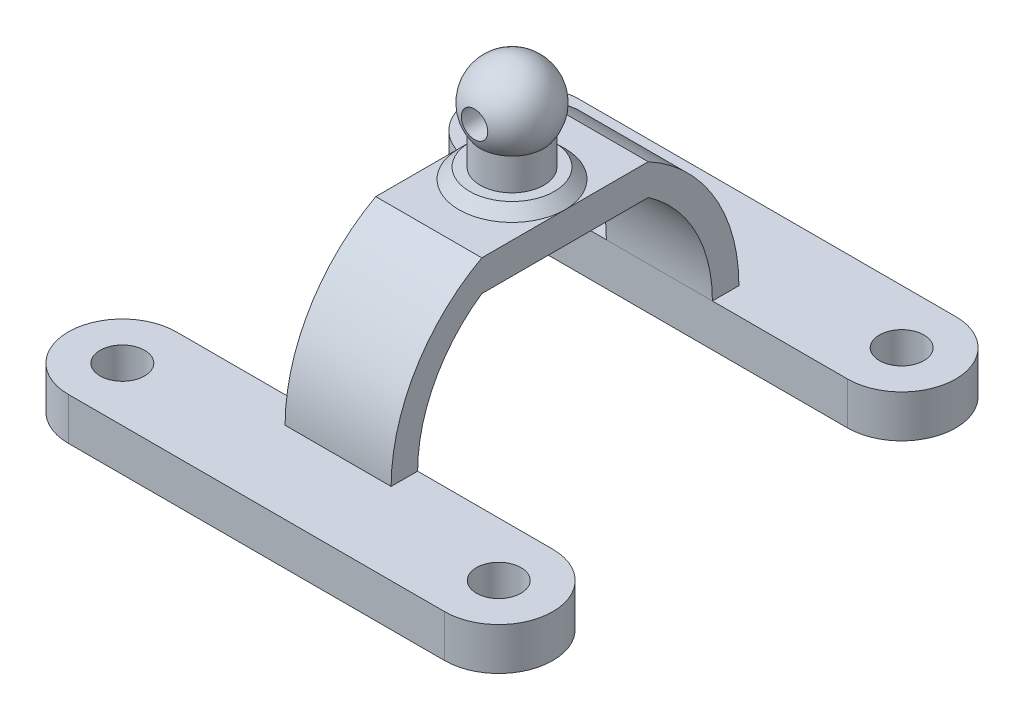
ISO-10303-21;
HEADER;
FILE_DESCRIPTION(('STEP AP214'),'2;1');
FILE_NAME('part.step','',(''),(''),'','','');
FILE_SCHEMA(('AUTOMOTIVE_DESIGN { 1 0 10303 214 1 1 1 1 }'));
ENDSEC;
DATA;
#1=APPLICATION_CONTEXT('core data for automotive mechanical design processes');
#2=APPLICATION_PROTOCOL_DEFINITION('international standard','automotive_design',2000,#1);
#3=PRODUCT_CONTEXT('',#1,'mechanical');
#4=PRODUCT('Part','Part','',(#3));
#5=PRODUCT_RELATED_PRODUCT_CATEGORY('part','',(#4));
#6=PRODUCT_DEFINITION_FORMATION('','',#4);
#7=PRODUCT_DEFINITION_CONTEXT('part definition',#1,'design');
#8=PRODUCT_DEFINITION('design','',#6,#7);
#9=PRODUCT_DEFINITION_SHAPE('','',#8);
#10=(LENGTH_UNIT() NAMED_UNIT(*) SI_UNIT(.MILLI.,.METRE.));
#11=(NAMED_UNIT(*) PLANE_ANGLE_UNIT() SI_UNIT($,.RADIAN.));
#12=(NAMED_UNIT(*) SI_UNIT($,.STERADIAN.) SOLID_ANGLE_UNIT());
#13=UNCERTAINTY_MEASURE_WITH_UNIT(LENGTH_MEASURE(1.E-05),#10,'distance_accuracy_value','');
#14=(GEOMETRIC_REPRESENTATION_CONTEXT(3) GLOBAL_UNCERTAINTY_ASSIGNED_CONTEXT((#13)) GLOBAL_UNIT_ASSIGNED_CONTEXT((#10,
#11,#12)) REPRESENTATION_CONTEXT('',''));
#15=CARTESIAN_POINT('',(0.,0.,0.));
#16=DIRECTION('',(0.,0.,1.));
#17=DIRECTION('',(1.,0.,0.));
#18=AXIS2_PLACEMENT_3D('',#15,#16,#17);
#19=CARTESIAN_POINT('',(5.,36.395,0.));
#20=DIRECTION('',(0.,1.,0.));
#21=DIRECTION('',(0.,0.,1.));
#22=AXIS2_PLACEMENT_3D('',#19,#20,#21);
#23=PLANE('',#22);
#24=CARTESIAN_POINT('',(0.,36.395,0.));
#25=DIRECTION('',(0.,1.,0.));
#26=DIRECTION('',(0.,0.,1.));
#27=AXIS2_PLACEMENT_3D('',#24,#25,#26);
#28=CIRCLE('',#27,5.);
#29=CARTESIAN_POINT('',(5.,36.395,0.));
#30=VERTEX_POINT('',#29);
#31=CARTESIAN_POINT('',(-5.,36.395,0.));
#32=VERTEX_POINT('',#31);
#33=EDGE_CURVE('E159',#30,#32,#28,.T.);
#34=ORIENTED_EDGE('',*,*,#33,.F.);
#35=DIRECTION('',(0.,0.,-1.));
#36=VECTOR('',#35,1.);
#37=CARTESIAN_POINT('',(5.,36.395,0.));
#38=LINE('',#37,#36);
#39=CARTESIAN_POINT('',(5.,36.395,-7.84856674813944));
#40=VERTEX_POINT('',#39);
#41=EDGE_CURVE('E170',#30,#40,#38,.T.);
#42=ORIENTED_EDGE('',*,*,#41,.T.);
#43=DIRECTION('',(-1.,0.,0.));
#44=VECTOR('',#43,1.);
#45=CARTESIAN_POINT('',(5.,36.395,-7.84856674813944));
#46=LINE('',#45,#44);
#47=CARTESIAN_POINT('',(-5.,36.395,-7.84856674813944));
#48=VERTEX_POINT('',#47);
#49=EDGE_CURVE('E283',#40,#48,#46,.T.);
#50=ORIENTED_EDGE('',*,*,#49,.T.);
#51=DIRECTION('',(0.,0.,-1.));
#52=VECTOR('',#51,1.);
#53=CARTESIAN_POINT('',(-5.,36.395,0.));
#54=LINE('',#53,#52);
#55=EDGE_CURVE('E179',#32,#48,#54,.T.);
#56=ORIENTED_EDGE('',*,*,#55,.F.);
#57=EDGE_LOOP('',(#34,#42,#50,#56));
#58=FACE_BOUND('',#57,.T.);
#59=ADVANCED_FACE('F36',(#58),#23,.T.);
#60=CARTESIAN_POINT('',(-17.7482393492988,16.995,-19.));
#61=DIRECTION('',(0.,1.,0.));
#62=DIRECTION('',(0.,0.,1.));
#63=AXIS2_PLACEMENT_3D('',#60,#61,#62);
#64=PLANE('',#63);
#65=CARTESIAN_POINT('',(-17.7482393492988,16.995,-19.));
#66=DIRECTION('',(0.,1.,0.));
#67=DIRECTION('',(0.,0.,1.));
#68=AXIS2_PLACEMENT_3D('',#65,#66,#67);
#69=CIRCLE('',#68,3.6);
#70=CARTESIAN_POINT('',(-17.7482393492988,16.995,-15.4));
#71=VERTEX_POINT('',#70);
#72=EDGE_CURVE('E350',#71,#71,#69,.T.);
#73=ORIENTED_EDGE('',*,*,#72,.F.);
#74=EDGE_LOOP('',(#73));
#75=FACE_BOUND('',#74,.T.);
#76=CARTESIAN_POINT('',(-17.7482393492988,16.995,-19.));
#77=DIRECTION('',(0.,1.,0.));
#78=DIRECTION('',(0.,0.,1.));
#79=AXIS2_PLACEMENT_3D('',#76,#77,#78);
#80=CIRCLE('',#79,2.1);
#81=CARTESIAN_POINT('',(-17.7482393492988,16.995,-16.9));
#82=VERTEX_POINT('',#81);
#83=EDGE_CURVE('E346',#82,#82,#80,.T.);
#84=ORIENTED_EDGE('',*,*,#83,.T.);
#85=EDGE_LOOP('',(#84));
#86=FACE_BOUND('',#85,.T.);
#87=ADVANCED_FACE('F390',(#75,#86),#64,.F.);
#88=CARTESIAN_POINT('',(-17.7482393492988,17.995,-19.));
#89=DIRECTION('',(0.,-1.,0.));
#90=DIRECTION('',(0.,0.,-1.));
#91=AXIS2_PLACEMENT_3D('',#88,#89,#90);
#92=CYLINDRICAL_SURFACE('',#91,3.6);
#93=CARTESIAN_POINT('',(-17.7482393492988,17.995,-19.));
#94=DIRECTION('',(0.,1.,0.));
#95=DIRECTION('',(0.,0.,1.));
#96=AXIS2_PLACEMENT_3D('',#93,#94,#95);
#97=CIRCLE('',#96,3.6);
#98=CARTESIAN_POINT('',(-17.7482393492988,17.995,-15.4));
#99=VERTEX_POINT('',#98);
#100=EDGE_CURVE('E160',#99,#99,#97,.T.);
#101=ORIENTED_EDGE('',*,*,#100,.F.);
#102=EDGE_LOOP('',(#101));
#103=FACE_BOUND('',#102,.T.);
#104=ORIENTED_EDGE('',*,*,#72,.T.);
#105=EDGE_LOOP('',(#104));
#106=FACE_BOUND('',#105,.T.);
#107=ADVANCED_FACE('F395',(#103,#106),#92,.T.);
#108=CARTESIAN_POINT('',(-17.7482393492988,17.995,-19.));
#109=DIRECTION('',(0.,-1.,0.));
#110=DIRECTION('',(0.,0.,-1.));
#111=AXIS2_PLACEMENT_3D('',#108,#109,#110);
#112=CYLINDRICAL_SURFACE('',#111,2.1);
#113=ORIENTED_EDGE('',*,*,#83,.F.);
#114=EDGE_LOOP('',(#113));
#115=FACE_BOUND('',#114,.T.);
#116=CARTESIAN_POINT('',(-17.7482393492988,21.995,-19.));
#117=DIRECTION('',(0.,1.,0.));
#118=DIRECTION('',(0.,0.,1.));
#119=AXIS2_PLACEMENT_3D('',#116,#117,#118);
#120=CIRCLE('',#119,2.1);
#121=CARTESIAN_POINT('',(-17.7482393492988,21.995,-16.9));
#122=VERTEX_POINT('',#121);
#123=EDGE_CURVE('E340',#122,#122,#120,.T.);
#124=ORIENTED_EDGE('',*,*,#123,.T.);
#125=EDGE_LOOP('',(#124));
#126=FACE_BOUND('',#125,.T.);
#127=ADVANCED_FACE('F463',(#115,#126),#112,.F.);
#128=CARTESIAN_POINT('',(-17.7482393492988,21.995,-19.));
#129=DIRECTION('',(0.,-1.,0.));
#130=DIRECTION('',(0.,0.,-1.));
#131=AXIS2_PLACEMENT_3D('',#128,#129,#130);
#132=CYLINDRICAL_SURFACE('',#131,5.1);
#133=CARTESIAN_POINT('',(-17.7482393492988,21.995,-19.));
#134=DIRECTION('',(0.,1.,0.));
#135=DIRECTION('',(0.,0.,1.));
#136=AXIS2_PLACEMENT_3D('',#133,#134,#135);
#137=CIRCLE('',#136,5.1);
#138=CARTESIAN_POINT('',(-17.7482393492988,21.995,-24.1));
#139=VERTEX_POINT('',#138);
#140=CARTESIAN_POINT('',(-17.7482393492988,21.995,-13.9));
#141=VERTEX_POINT('',#140);
#142=EDGE_CURVE('E343',#139,#141,#137,.T.);
#143=ORIENTED_EDGE('',*,*,#142,.F.);
#144=DIRECTION('',(0.,1.,0.));
#145=VECTOR('',#144,1.);
#146=CARTESIAN_POINT('',(-17.7482393492988,17.995,-24.1));
#147=LINE('',#146,#145);
#148=CARTESIAN_POINT('',(-17.7482393492988,17.995,-24.1));
#149=VERTEX_POINT('',#148);
#150=EDGE_CURVE('E330',#149,#139,#147,.T.);
#151=ORIENTED_EDGE('',*,*,#150,.F.);
#152=CARTESIAN_POINT('',(-17.7482393492988,17.995,-19.));
#153=DIRECTION('',(0.,1.,0.));
#154=DIRECTION('',(0.,0.,1.));
#155=AXIS2_PLACEMENT_3D('',#152,#153,#154);
#156=CIRCLE('',#155,5.1);
#157=CARTESIAN_POINT('',(-17.7482393492988,17.995,-13.9));
#158=VERTEX_POINT('',#157);
#159=EDGE_CURVE('E333',#149,#158,#156,.T.);
#160=ORIENTED_EDGE('',*,*,#159,.T.);
#161=DIRECTION('',(0.,1.,0.));
#162=VECTOR('',#161,1.);
#163=CARTESIAN_POINT('',(-17.7482393492988,17.995,-13.9));
#164=LINE('',#163,#162);
#165=EDGE_CURVE('E324',#158,#141,#164,.T.);
#166=ORIENTED_EDGE('',*,*,#165,.T.);
#167=EDGE_LOOP('',(#143,#151,#160,#166));
#168=FACE_BOUND('',#167,.T.);
#169=ADVANCED_FACE('F457',(#168),#132,.T.);
#170=CARTESIAN_POINT('',(0.,21.995,0.));
#171=DIRECTION('',(0.,1.,0.));
#172=DIRECTION('',(0.,0.,1.));
#173=AXIS2_PLACEMENT_3D('',#170,#171,#172);
#174=PLANE('',#173);
#175=DIRECTION('',(0.,0.,1.));
#176=VECTOR('',#175,1.);
#177=CARTESIAN_POINT('',(5.,21.995,0.));
#178=LINE('',#177,#176);
#179=CARTESIAN_POINT('',(5.,21.995,-16.4));
#180=VERTEX_POINT('',#179);
#181=CARTESIAN_POINT('',(5.,21.995,-13.9));
#182=VERTEX_POINT('',#181);
#183=EDGE_CURVE('E260',#180,#182,#178,.T.);
#184=ORIENTED_EDGE('',*,*,#183,.T.);
#185=DIRECTION('',(1.,0.,0.));
#186=VECTOR('',#185,1.);
#187=CARTESIAN_POINT('',(0.,21.995,-13.9));
#188=LINE('',#187,#186);
#189=CARTESIAN_POINT('',(17.7482393492988,21.995,-13.9));
#190=VERTEX_POINT('',#189);
#191=EDGE_CURVE('E314',#182,#190,#188,.T.);
#192=ORIENTED_EDGE('',*,*,#191,.T.);
#193=CARTESIAN_POINT('',(17.7482393492988,21.995,-19.));
#194=DIRECTION('',(0.,1.,0.));
#195=DIRECTION('',(0.,0.,1.));
#196=AXIS2_PLACEMENT_3D('',#193,#194,#195);
#197=CIRCLE('',#196,5.1);
#198=CARTESIAN_POINT('',(17.7482393492988,21.995,-24.1));
#199=VERTEX_POINT('',#198);
#200=EDGE_CURVE('E303',#190,#199,#197,.T.);
#201=ORIENTED_EDGE('',*,*,#200,.T.);
#202=DIRECTION('',(1.,0.,0.));
#203=VECTOR('',#202,1.);
#204=CARTESIAN_POINT('',(0.,21.995,-24.1));
#205=LINE('',#204,#203);
#206=EDGE_CURVE('E321',#139,#199,#205,.T.);
#207=ORIENTED_EDGE('',*,*,#206,.F.);
#208=ORIENTED_EDGE('',*,*,#142,.T.);
#209=CARTESIAN_POINT('',(-5.,21.995,-13.9));
#210=VERTEX_POINT('',#209);
#211=EDGE_CURVE('E325',#141,#210,#188,.T.);
#212=ORIENTED_EDGE('',*,*,#211,.T.);
#213=DIRECTION('',(0.,0.,1.));
#214=VECTOR('',#213,1.);
#215=CARTESIAN_POINT('',(-5.,21.995,0.));
#216=LINE('',#215,#214);
#217=CARTESIAN_POINT('',(-5.,21.995,-16.4));
#218=VERTEX_POINT('',#217);
#219=EDGE_CURVE('E275',#218,#210,#216,.T.);
#220=ORIENTED_EDGE('',*,*,#219,.F.);
#221=DIRECTION('',(-1.,0.,0.));
#222=VECTOR('',#221,1.);
#223=CARTESIAN_POINT('',(5.,21.995,-16.4));
#224=LINE('',#223,#222);
#225=EDGE_CURVE('E60',#180,#218,#224,.T.);
#226=ORIENTED_EDGE('',*,*,#225,.F.);
#227=EDGE_LOOP('',(#184,#192,#201,#207,#208,#212,#220,#226));
#228=FACE_BOUND('',#227,.T.);
#229=ORIENTED_EDGE('',*,*,#123,.F.);
#230=EDGE_LOOP('',(#229));
#231=FACE_BOUND('',#230,.T.);
#232=CARTESIAN_POINT('',(17.7482393492988,21.995,-19.));
#233=DIRECTION('',(0.,1.,0.));
#234=DIRECTION('',(0.,0.,1.));
#235=AXIS2_PLACEMENT_3D('',#232,#233,#234);
#236=CIRCLE('',#235,2.1);
#237=CARTESIAN_POINT('',(17.7482393492988,21.995,-16.9));
#238=VERTEX_POINT('',#237);
#239=EDGE_CURVE('E300',#238,#238,#236,.T.);
#240=ORIENTED_EDGE('',*,*,#239,.F.);
#241=EDGE_LOOP('',(#240));
#242=FACE_BOUND('',#241,.T.);
#243=ADVANCED_FACE('F454',(#228,#231,#242),#174,.T.);
#244=CARTESIAN_POINT('',(0.,17.995,0.));
#245=DIRECTION('',(0.,1.,0.));
#246=DIRECTION('',(0.,0.,1.));
#247=AXIS2_PLACEMENT_3D('',#244,#245,#246);
#248=PLANE('',#247);
#249=ORIENTED_EDGE('',*,*,#100,.T.);
#250=EDGE_LOOP('',(#249));
#251=FACE_BOUND('',#250,.T.);
#252=ORIENTED_EDGE('',*,*,#159,.F.);
#253=DIRECTION('',(1.,0.,0.));
#254=VECTOR('',#253,1.);
#255=CARTESIAN_POINT('',(0.,17.995,-24.1));
#256=LINE('',#255,#254);
#257=CARTESIAN_POINT('',(17.7482393492988,17.995,-24.1));
#258=VERTEX_POINT('',#257);
#259=EDGE_CURVE('E320',#149,#258,#256,.T.);
#260=ORIENTED_EDGE('',*,*,#259,.T.);
#261=CARTESIAN_POINT('',(17.7482393492988,17.995,-19.));
#262=DIRECTION('',(0.,1.,0.));
#263=DIRECTION('',(0.,0.,1.));
#264=AXIS2_PLACEMENT_3D('',#261,#262,#263);
#265=CIRCLE('',#264,5.1);
#266=CARTESIAN_POINT('',(17.7482393492988,17.995,-13.9));
#267=VERTEX_POINT('',#266);
#268=EDGE_CURVE('E299',#267,#258,#265,.T.);
#269=ORIENTED_EDGE('',*,*,#268,.F.);
#270=DIRECTION('',(1.,0.,0.));
#271=VECTOR('',#270,1.);
#272=CARTESIAN_POINT('',(0.,17.995,-13.9));
#273=LINE('',#272,#271);
#274=EDGE_CURVE('E317',#158,#267,#273,.T.);
#275=ORIENTED_EDGE('',*,*,#274,.F.);
#276=EDGE_LOOP('',(#252,#260,#269,#275));
#277=FACE_BOUND('',#276,.T.);
#278=CARTESIAN_POINT('',(17.7482393492988,17.995,-19.));
#279=DIRECTION('',(0.,1.,0.));
#280=DIRECTION('',(0.,0.,1.));
#281=AXIS2_PLACEMENT_3D('',#278,#279,#280);
#282=CIRCLE('',#281,3.6);
#283=CARTESIAN_POINT('',(17.7482393492988,17.995,-15.4));
#284=VERTEX_POINT('',#283);
#285=EDGE_CURVE('E311',#284,#284,#282,.T.);
#286=ORIENTED_EDGE('',*,*,#285,.T.);
#287=EDGE_LOOP('',(#286));
#288=FACE_BOUND('',#287,.T.);
#289=ADVANCED_FACE('F449',(#251,#277,#288),#248,.F.);
#290=CARTESIAN_POINT('',(0.,17.995,-24.1));
#291=DIRECTION('',(0.,0.,1.));
#292=DIRECTION('',(0.,-1.,0.));
#293=AXIS2_PLACEMENT_3D('',#290,#291,#292);
#294=PLANE('',#293);
#295=ORIENTED_EDGE('',*,*,#206,.T.);
#296=DIRECTION('',(0.,1.,0.));
#297=VECTOR('',#296,1.);
#298=CARTESIAN_POINT('',(17.7482393492988,17.995,-24.1));
#299=LINE('',#298,#297);
#300=EDGE_CURVE('E334',#258,#199,#299,.T.);
#301=ORIENTED_EDGE('',*,*,#300,.F.);
#302=ORIENTED_EDGE('',*,*,#259,.F.);
#303=ORIENTED_EDGE('',*,*,#150,.T.);
#304=EDGE_LOOP('',(#295,#301,#302,#303));
#305=FACE_BOUND('',#304,.T.);
#306=ADVANCED_FACE('F446',(#305),#294,.F.);
#307=CARTESIAN_POINT('',(0.,17.995,-13.9));
#308=DIRECTION('',(0.,0.,1.));
#309=DIRECTION('',(0.,-1.,0.));
#310=AXIS2_PLACEMENT_3D('',#307,#308,#309);
#311=PLANE('',#310);
#312=ORIENTED_EDGE('',*,*,#211,.F.);
#313=ORIENTED_EDGE('',*,*,#165,.F.);
#314=ORIENTED_EDGE('',*,*,#274,.T.);
#315=DIRECTION('',(0.,1.,0.));
#316=VECTOR('',#315,1.);
#317=CARTESIAN_POINT('',(17.7482393492988,17.995,-13.9));
#318=LINE('',#317,#316);
#319=EDGE_CURVE('E336',#267,#190,#318,.T.);
#320=ORIENTED_EDGE('',*,*,#319,.T.);
#321=ORIENTED_EDGE('',*,*,#191,.F.);
#322=DIRECTION('',(-1.,0.,0.));
#323=VECTOR('',#322,1.);
#324=CARTESIAN_POINT('',(5.,21.995,-13.9));
#325=LINE('',#324,#323);
#326=EDGE_CURVE('E286',#182,#210,#325,.T.);
#327=ORIENTED_EDGE('',*,*,#326,.T.);
#328=EDGE_LOOP('',(#312,#313,#314,#320,#321,#327));
#329=FACE_BOUND('',#328,.T.);
#330=ADVANCED_FACE('F434',(#329),#311,.T.);
#331=CARTESIAN_POINT('',(17.7482393492988,21.995,-19.));
#332=DIRECTION('',(0.,-1.,0.));
#333=DIRECTION('',(0.,0.,-1.));
#334=AXIS2_PLACEMENT_3D('',#331,#332,#333);
#335=CYLINDRICAL_SURFACE('',#334,5.1);
#336=ORIENTED_EDGE('',*,*,#268,.T.);
#337=ORIENTED_EDGE('',*,*,#300,.T.);
#338=ORIENTED_EDGE('',*,*,#200,.F.);
#339=ORIENTED_EDGE('',*,*,#319,.F.);
#340=EDGE_LOOP('',(#336,#337,#338,#339));
#341=FACE_BOUND('',#340,.T.);
#342=ADVANCED_FACE('F430',(#341),#335,.T.);
#343=CARTESIAN_POINT('',(17.7482393492988,16.995,-19.));
#344=DIRECTION('',(0.,1.,0.));
#345=DIRECTION('',(0.,0.,1.));
#346=AXIS2_PLACEMENT_3D('',#343,#344,#345);
#347=PLANE('',#346);
#348=CARTESIAN_POINT('',(17.7482393492988,16.995,-19.));
#349=DIRECTION('',(0.,1.,0.));
#350=DIRECTION('',(0.,0.,1.));
#351=AXIS2_PLACEMENT_3D('',#348,#349,#350);
#352=CIRCLE('',#351,3.6);
#353=CARTESIAN_POINT('',(17.7482393492988,16.995,-15.4));
#354=VERTEX_POINT('',#353);
#355=EDGE_CURVE('E310',#354,#354,#352,.T.);
#356=ORIENTED_EDGE('',*,*,#355,.F.);
#357=EDGE_LOOP('',(#356));
#358=FACE_BOUND('',#357,.T.);
#359=CARTESIAN_POINT('',(17.7482393492988,16.995,-19.));
#360=DIRECTION('',(0.,1.,0.));
#361=DIRECTION('',(0.,0.,1.));
#362=AXIS2_PLACEMENT_3D('',#359,#360,#361);
#363=CIRCLE('',#362,2.1);
#364=CARTESIAN_POINT('',(17.7482393492988,16.995,-16.9));
#365=VERTEX_POINT('',#364);
#366=EDGE_CURVE('E306',#365,#365,#363,.T.);
#367=ORIENTED_EDGE('',*,*,#366,.T.);
#368=EDGE_LOOP('',(#367));
#369=FACE_BOUND('',#368,.T.);
#370=ADVANCED_FACE('F433',(#358,#369),#347,.F.);
#371=CARTESIAN_POINT('',(17.7482393492988,17.995,-19.));
#372=DIRECTION('',(0.,-1.,0.));
#373=DIRECTION('',(0.,0.,-1.));
#374=AXIS2_PLACEMENT_3D('',#371,#372,#373);
#375=CYLINDRICAL_SURFACE('',#374,3.6);
#376=ORIENTED_EDGE('',*,*,#285,.F.);
#377=EDGE_LOOP('',(#376));
#378=FACE_BOUND('',#377,.T.);
#379=ORIENTED_EDGE('',*,*,#355,.T.);
#380=EDGE_LOOP('',(#379));
#381=FACE_BOUND('',#380,.T.);
#382=ADVANCED_FACE('F438',(#378,#381),#375,.T.);
#383=CARTESIAN_POINT('',(17.7482393492988,17.995,-19.));
#384=DIRECTION('',(0.,-1.,0.));
#385=DIRECTION('',(0.,0.,-1.));
#386=AXIS2_PLACEMENT_3D('',#383,#384,#385);
#387=CYLINDRICAL_SURFACE('',#386,2.1);
#388=ORIENTED_EDGE('',*,*,#366,.F.);
#389=EDGE_LOOP('',(#388));
#390=FACE_BOUND('',#389,.T.);
#391=ORIENTED_EDGE('',*,*,#239,.T.);
#392=EDGE_LOOP('',(#391));
#393=FACE_BOUND('',#392,.T.);
#394=ADVANCED_FACE('F428',(#390,#393),#387,.F.);
#395=CARTESIAN_POINT('',(5.,21.995,0.));
#396=DIRECTION('',(-1.,0.,0.));
#397=DIRECTION('',(0.,0.,1.));
#398=AXIS2_PLACEMENT_3D('',#395,#396,#397);
#399=CYLINDRICAL_SURFACE('',#398,16.4);
#400=CARTESIAN_POINT('',(-5.,21.995,0.));
#401=DIRECTION('',(1.,0.,0.));
#402=DIRECTION('',(0.,0.,-1.));
#403=AXIS2_PLACEMENT_3D('',#400,#401,#402);
#404=CIRCLE('',#403,16.4);
#405=CARTESIAN_POINT('',(-5.,21.995,16.4));
#406=VERTEX_POINT('',#405);
#407=CARTESIAN_POINT('',(-5.,36.395,7.84856674813943));
#408=VERTEX_POINT('',#407);
#409=EDGE_CURVE('E245',#406,#408,#404,.F.);
#410=ORIENTED_EDGE('',*,*,#409,.F.);
#411=DIRECTION('',(-1.,0.,0.));
#412=VECTOR('',#411,1.);
#413=CARTESIAN_POINT('',(5.,21.995,16.4));
#414=LINE('',#413,#412);
#415=CARTESIAN_POINT('',(5.,21.995,16.4));
#416=VERTEX_POINT('',#415);
#417=EDGE_CURVE('E297',#416,#406,#414,.T.);
#418=ORIENTED_EDGE('',*,*,#417,.F.);
#419=CARTESIAN_POINT('',(5.,21.995,0.));
#420=DIRECTION('',(1.,0.,0.));
#421=DIRECTION('',(0.,0.,-1.));
#422=AXIS2_PLACEMENT_3D('',#419,#420,#421);
#423=CIRCLE('',#422,16.4);
#424=CARTESIAN_POINT('',(5.,36.395,7.84856674813943));
#425=VERTEX_POINT('',#424);
#426=EDGE_CURVE('E248',#416,#425,#423,.F.);
#427=ORIENTED_EDGE('',*,*,#426,.T.);
#428=DIRECTION('',(-1.,0.,0.));
#429=VECTOR('',#428,1.);
#430=CARTESIAN_POINT('',(5.,36.395,7.84856674813943));
#431=LINE('',#430,#429);
#432=EDGE_CURVE('E166',#425,#408,#431,.T.);
#433=ORIENTED_EDGE('',*,*,#432,.T.);
#434=EDGE_LOOP('',(#410,#418,#427,#433));
#435=FACE_BOUND('',#434,.T.);
#436=ADVANCED_FACE('F424',(#435),#399,.T.);
#437=CARTESIAN_POINT('',(5.,21.995,0.));
#438=DIRECTION('',(-1.,0.,0.));
#439=DIRECTION('',(0.,0.,1.));
#440=AXIS2_PLACEMENT_3D('',#437,#438,#439);
#441=CYLINDRICAL_SURFACE('',#440,13.9);
#442=CARTESIAN_POINT('',(-5.,21.995,0.));
#443=DIRECTION('',(1.,0.,0.));
#444=DIRECTION('',(0.,0.,-1.));
#445=AXIS2_PLACEMENT_3D('',#442,#443,#444);
#446=CIRCLE('',#445,13.9);
#447=CARTESIAN_POINT('',(-5.,21.995,13.9));
#448=VERTEX_POINT('',#447);
#449=CARTESIAN_POINT('',(-5.,33.4671401665077,7.84856674813943));
#450=VERTEX_POINT('',#449);
#451=EDGE_CURVE('E268',#448,#450,#446,.F.);
#452=ORIENTED_EDGE('',*,*,#451,.T.);
#453=DIRECTION('',(-1.,0.,0.));
#454=VECTOR('',#453,1.);
#455=CARTESIAN_POINT('',(5.,33.4671401665077,7.84856674813943));
#456=LINE('',#455,#454);
#457=CARTESIAN_POINT('',(5.,33.4671401665077,7.84856674813943));
#458=VERTEX_POINT('',#457);
#459=EDGE_CURVE('E291',#458,#450,#456,.T.);
#460=ORIENTED_EDGE('',*,*,#459,.F.);
#461=CARTESIAN_POINT('',(5.,21.995,0.));
#462=DIRECTION('',(1.,0.,0.));
#463=DIRECTION('',(0.,0.,-1.));
#464=AXIS2_PLACEMENT_3D('',#461,#462,#463);
#465=CIRCLE('',#464,13.9);
#466=CARTESIAN_POINT('',(5.,21.995,13.9));
#467=VERTEX_POINT('',#466);
#468=EDGE_CURVE('E253',#467,#458,#465,.F.);
#469=ORIENTED_EDGE('',*,*,#468,.F.);
#470=DIRECTION('',(-1.,0.,0.));
#471=VECTOR('',#470,1.);
#472=CARTESIAN_POINT('',(5.,21.995,13.9));
#473=LINE('',#472,#471);
#474=EDGE_CURVE('E294',#467,#448,#473,.T.);
#475=ORIENTED_EDGE('',*,*,#474,.T.);
#476=EDGE_LOOP('',(#452,#460,#469,#475));
#477=FACE_BOUND('',#476,.T.);
#478=ADVANCED_FACE('F420',(#477),#441,.F.);
#479=CARTESIAN_POINT('',(5.,33.4671401665077,0.));
#480=DIRECTION('',(0.,1.,0.));
#481=DIRECTION('',(0.,0.,1.));
#482=AXIS2_PLACEMENT_3D('',#479,#480,#481);
#483=PLANE('',#482);
#484=DIRECTION('',(0.,0.,-1.));
#485=VECTOR('',#484,1.);
#486=CARTESIAN_POINT('',(-5.,33.4671401665077,0.));
#487=LINE('',#486,#485);
#488=CARTESIAN_POINT('',(-5.,33.4671401665077,-7.84856674813944));
#489=VERTEX_POINT('',#488);
#490=EDGE_CURVE('E270',#450,#489,#487,.T.);
#491=ORIENTED_EDGE('',*,*,#490,.T.);
#492=DIRECTION('',(-1.,0.,0.));
#493=VECTOR('',#492,1.);
#494=CARTESIAN_POINT('',(5.,33.4671401665077,-7.84856674813944));
#495=LINE('',#494,#493);
#496=CARTESIAN_POINT('',(5.,33.4671401665077,-7.84856674813944));
#497=VERTEX_POINT('',#496);
#498=EDGE_CURVE('E288',#497,#489,#495,.T.);
#499=ORIENTED_EDGE('',*,*,#498,.F.);
#500=DIRECTION('',(0.,0.,-1.));
#501=VECTOR('',#500,1.);
#502=CARTESIAN_POINT('',(5.,33.4671401665077,0.));
#503=LINE('',#502,#501);
#504=EDGE_CURVE('E255',#458,#497,#503,.T.);
#505=ORIENTED_EDGE('',*,*,#504,.F.);
#506=ORIENTED_EDGE('',*,*,#459,.T.);
#507=EDGE_LOOP('',(#491,#499,#505,#506));
#508=FACE_BOUND('',#507,.T.);
#509=ADVANCED_FACE('F413',(#508),#483,.F.);
#510=CARTESIAN_POINT('',(5.,21.995,0.));
#511=DIRECTION('',(-1.,0.,0.));
#512=DIRECTION('',(0.,0.,1.));
#513=AXIS2_PLACEMENT_3D('',#510,#511,#512);
#514=CYLINDRICAL_SURFACE('',#513,13.9);
#515=CARTESIAN_POINT('',(-5.,21.995,0.));
#516=DIRECTION('',(1.,0.,0.));
#517=DIRECTION('',(0.,0.,-1.));
#518=AXIS2_PLACEMENT_3D('',#515,#516,#517);
#519=CIRCLE('',#518,13.9);
#520=EDGE_CURVE('E272',#489,#210,#519,.F.);
#521=ORIENTED_EDGE('',*,*,#520,.T.);
#522=ORIENTED_EDGE('',*,*,#326,.F.);
#523=CARTESIAN_POINT('',(5.,21.995,0.));
#524=DIRECTION('',(1.,0.,0.));
#525=DIRECTION('',(0.,0.,-1.));
#526=AXIS2_PLACEMENT_3D('',#523,#524,#525);
#527=CIRCLE('',#526,13.9);
#528=EDGE_CURVE('E257',#497,#182,#527,.F.);
#529=ORIENTED_EDGE('',*,*,#528,.F.);
#530=ORIENTED_EDGE('',*,*,#498,.T.);
#531=EDGE_LOOP('',(#521,#522,#529,#530));
#532=FACE_BOUND('',#531,.T.);
#533=ADVANCED_FACE('F408',(#532),#514,.F.);
#534=CARTESIAN_POINT('',(5.,21.995,0.));
#535=DIRECTION('',(-1.,0.,0.));
#536=DIRECTION('',(0.,0.,1.));
#537=AXIS2_PLACEMENT_3D('',#534,#535,#536);
#538=CYLINDRICAL_SURFACE('',#537,16.4);
#539=CARTESIAN_POINT('',(-5.,21.995,0.));
#540=DIRECTION('',(1.,0.,0.));
#541=DIRECTION('',(0.,0.,-1.));
#542=AXIS2_PLACEMENT_3D('',#539,#540,#541);
#543=CIRCLE('',#542,16.4);
#544=EDGE_CURVE('E278',#48,#218,#543,.F.);
#545=ORIENTED_EDGE('',*,*,#544,.F.);
#546=ORIENTED_EDGE('',*,*,#49,.F.);
#547=CARTESIAN_POINT('',(5.,21.995,0.));
#548=DIRECTION('',(1.,0.,0.));
#549=DIRECTION('',(0.,0.,-1.));
#550=AXIS2_PLACEMENT_3D('',#547,#548,#549);
#551=CIRCLE('',#550,16.4);
#552=EDGE_CURVE('E175',#40,#180,#551,.F.);
#553=ORIENTED_EDGE('',*,*,#552,.T.);
#554=ORIENTED_EDGE('',*,*,#225,.T.);
#555=EDGE_LOOP('',(#545,#546,#553,#554));
#556=FACE_BOUND('',#555,.T.);
#557=ADVANCED_FACE('F401',(#556),#538,.T.);
#558=EDGE_CURVE('E52',#32,#30,#28,.T.);
#559=ORIENTED_EDGE('',*,*,#558,.F.);
#560=EDGE_CURVE('E251',#408,#32,#54,.T.);
#561=ORIENTED_EDGE('',*,*,#560,.F.);
#562=ORIENTED_EDGE('',*,*,#432,.F.);
#563=EDGE_CURVE('E163',#425,#30,#38,.T.);
#564=ORIENTED_EDGE('',*,*,#563,.T.);
#565=EDGE_LOOP('',(#559,#561,#562,#564));
#566=FACE_BOUND('',#565,.T.);
#567=ADVANCED_FACE('F165',(#566),#23,.T.);
#568=CARTESIAN_POINT('',(5.,0.,0.));
#569=DIRECTION('',(1.,0.,0.));
#570=DIRECTION('',(0.,0.,-1.));
#571=AXIS2_PLACEMENT_3D('',#568,#569,#570);
#572=PLANE('',#571);
#573=ORIENTED_EDGE('',*,*,#426,.F.);
#574=DIRECTION('',(0.,0.,1.));
#575=VECTOR('',#574,1.);
#576=CARTESIAN_POINT('',(5.,21.995,0.));
#577=LINE('',#576,#575);
#578=EDGE_CURVE('E250',#467,#416,#577,.T.);
#579=ORIENTED_EDGE('',*,*,#578,.F.);
#580=ORIENTED_EDGE('',*,*,#468,.T.);
#581=ORIENTED_EDGE('',*,*,#504,.T.);
#582=ORIENTED_EDGE('',*,*,#528,.T.);
#583=ORIENTED_EDGE('',*,*,#183,.F.);
#584=ORIENTED_EDGE('',*,*,#552,.F.);
#585=ORIENTED_EDGE('',*,*,#41,.F.);
#586=ORIENTED_EDGE('',*,*,#563,.F.);
#587=EDGE_LOOP('',(#573,#579,#580,#581,#582,#583,#584,#585,#586));
#588=FACE_BOUND('',#587,.T.);
#589=ADVANCED_FACE('F173',(#588),#572,.T.);
#590=CARTESIAN_POINT('',(-5.,0.,0.));
#591=DIRECTION('',(1.,0.,0.));
#592=DIRECTION('',(0.,0.,-1.));
#593=AXIS2_PLACEMENT_3D('',#590,#591,#592);
#594=PLANE('',#593);
#595=ORIENTED_EDGE('',*,*,#409,.T.);
#596=ORIENTED_EDGE('',*,*,#560,.T.);
#597=ORIENTED_EDGE('',*,*,#55,.T.);
#598=ORIENTED_EDGE('',*,*,#544,.T.);
#599=ORIENTED_EDGE('',*,*,#219,.T.);
#600=ORIENTED_EDGE('',*,*,#520,.F.);
#601=ORIENTED_EDGE('',*,*,#490,.F.);
#602=ORIENTED_EDGE('',*,*,#451,.F.);
#603=DIRECTION('',(0.,0.,1.));
#604=VECTOR('',#603,1.);
#605=CARTESIAN_POINT('',(-5.,21.995,0.));
#606=LINE('',#605,#604);
#607=EDGE_CURVE('E265',#448,#406,#606,.T.);
#608=ORIENTED_EDGE('',*,*,#607,.T.);
#609=EDGE_LOOP('',(#595,#596,#597,#598,#599,#600,#601,#602,#608));
#610=FACE_BOUND('',#609,.T.);
#611=ADVANCED_FACE('F406',(#610),#594,.F.);
#612=CARTESIAN_POINT('',(17.7482393492988,21.995,19.));
#613=DIRECTION('',(0.,-1.,0.));
#614=DIRECTION('',(0.,0.,-1.));
#615=AXIS2_PLACEMENT_3D('',#612,#613,#614);
#616=CYLINDRICAL_SURFACE('',#615,5.1);
#617=DIRECTION('',(0.,1.,0.));
#618=VECTOR('',#617,1.);
#619=CARTESIAN_POINT('',(17.7482393492988,17.995,13.9));
#620=LINE('',#619,#618);
#621=CARTESIAN_POINT('',(17.7482393492988,17.995,13.9));
#622=VERTEX_POINT('',#621);
#623=CARTESIAN_POINT('',(17.7482393492988,21.995,13.9));
#624=VERTEX_POINT('',#623);
#625=EDGE_CURVE('E223',#622,#624,#620,.T.);
#626=ORIENTED_EDGE('',*,*,#625,.T.);
#627=CARTESIAN_POINT('',(17.7482393492988,21.995,19.));
#628=DIRECTION('',(0.,1.,0.));
#629=DIRECTION('',(0.,0.,1.));
#630=AXIS2_PLACEMENT_3D('',#627,#628,#629);
#631=CIRCLE('',#630,5.1);
#632=CARTESIAN_POINT('',(17.7482393492988,21.995,24.1));
#633=VERTEX_POINT('',#632);
#634=EDGE_CURVE('E234',#633,#624,#631,.T.);
#635=ORIENTED_EDGE('',*,*,#634,.F.);
#636=DIRECTION('',(0.,1.,0.));
#637=VECTOR('',#636,1.);
#638=CARTESIAN_POINT('',(17.7482393492988,17.995,24.1));
#639=LINE('',#638,#637);
#640=CARTESIAN_POINT('',(17.7482393492988,17.995,24.1));
#641=VERTEX_POINT('',#640);
#642=EDGE_CURVE('E226',#641,#633,#639,.T.);
#643=ORIENTED_EDGE('',*,*,#642,.F.);
#644=CARTESIAN_POINT('',(17.7482393492988,17.995,19.));
#645=DIRECTION('',(0.,1.,0.));
#646=DIRECTION('',(0.,0.,1.));
#647=AXIS2_PLACEMENT_3D('',#644,#645,#646);
#648=CIRCLE('',#647,5.1);
#649=EDGE_CURVE('E222',#641,#622,#648,.T.);
#650=ORIENTED_EDGE('',*,*,#649,.T.);
#651=EDGE_LOOP('',(#626,#635,#643,#650));
#652=FACE_BOUND('',#651,.T.);
#653=ADVANCED_FACE('F529',(#652),#616,.T.);
#654=CARTESIAN_POINT('',(17.7482393492988,16.995,19.));
#655=DIRECTION('',(0.,1.,0.));
#656=DIRECTION('',(0.,0.,1.));
#657=AXIS2_PLACEMENT_3D('',#654,#655,#656);
#658=PLANE('',#657);
#659=CARTESIAN_POINT('',(17.7482393492988,16.995,19.));
#660=DIRECTION('',(0.,1.,0.));
#661=DIRECTION('',(0.,0.,1.));
#662=AXIS2_PLACEMENT_3D('',#659,#660,#661);
#663=CIRCLE('',#662,3.6);
#664=CARTESIAN_POINT('',(17.7482393492988,16.995,22.6));
#665=VERTEX_POINT('',#664);
#666=EDGE_CURVE('E241',#665,#665,#663,.T.);
#667=ORIENTED_EDGE('',*,*,#666,.F.);
#668=EDGE_LOOP('',(#667));
#669=FACE_BOUND('',#668,.T.);
#670=CARTESIAN_POINT('',(17.7482393492988,16.995,19.));
#671=DIRECTION('',(0.,1.,0.));
#672=DIRECTION('',(0.,0.,1.));
#673=AXIS2_PLACEMENT_3D('',#670,#671,#672);
#674=CIRCLE('',#673,2.1);
#675=CARTESIAN_POINT('',(17.7482393492988,16.995,21.1));
#676=VERTEX_POINT('',#675);
#677=EDGE_CURVE('E237',#676,#676,#674,.T.);
#678=ORIENTED_EDGE('',*,*,#677,.T.);
#679=EDGE_LOOP('',(#678));
#680=FACE_BOUND('',#679,.T.);
#681=ADVANCED_FACE('F531',(#669,#680),#658,.F.);
#682=CARTESIAN_POINT('',(17.7482393492988,17.995,19.));
#683=DIRECTION('',(0.,-1.,0.));
#684=DIRECTION('',(0.,0.,-1.));
#685=AXIS2_PLACEMENT_3D('',#682,#683,#684);
#686=CYLINDRICAL_SURFACE('',#685,3.6);
#687=CARTESIAN_POINT('',(17.7482393492988,17.995,19.));
#688=DIRECTION('',(0.,1.,0.));
#689=DIRECTION('',(0.,0.,1.));
#690=AXIS2_PLACEMENT_3D('',#687,#688,#689);
#691=CIRCLE('',#690,3.6);
#692=CARTESIAN_POINT('',(17.7482393492988,17.995,22.6));
#693=VERTEX_POINT('',#692);
#694=EDGE_CURVE('E242',#693,#693,#691,.T.);
#695=ORIENTED_EDGE('',*,*,#694,.F.);
#696=EDGE_LOOP('',(#695));
#697=FACE_BOUND('',#696,.T.);
#698=ORIENTED_EDGE('',*,*,#666,.T.);
#699=EDGE_LOOP('',(#698));
#700=FACE_BOUND('',#699,.T.);
#701=ADVANCED_FACE('F537',(#697,#700),#686,.T.);
#702=CARTESIAN_POINT('',(17.7482393492988,17.995,19.));
#703=DIRECTION('',(0.,-1.,0.));
#704=DIRECTION('',(0.,0.,-1.));
#705=AXIS2_PLACEMENT_3D('',#702,#703,#704);
#706=CYLINDRICAL_SURFACE('',#705,2.1);
#707=ORIENTED_EDGE('',*,*,#677,.F.);
#708=EDGE_LOOP('',(#707));
#709=FACE_BOUND('',#708,.T.);
#710=CARTESIAN_POINT('',(17.7482393492988,21.995,19.));
#711=DIRECTION('',(0.,1.,0.));
#712=DIRECTION('',(0.,0.,1.));
#713=AXIS2_PLACEMENT_3D('',#710,#711,#712);
#714=CIRCLE('',#713,2.1);
#715=CARTESIAN_POINT('',(17.7482393492988,21.995,21.1));
#716=VERTEX_POINT('',#715);
#717=EDGE_CURVE('E231',#716,#716,#714,.F.);
#718=ORIENTED_EDGE('',*,*,#717,.F.);
#719=EDGE_LOOP('',(#718));
#720=FACE_BOUND('',#719,.T.);
#721=ADVANCED_FACE('F543',(#709,#720),#706,.F.);
#722=CARTESIAN_POINT('',(0.,21.995,0.));
#723=DIRECTION('',(0.,1.,0.));
#724=DIRECTION('',(0.,0.,1.));
#725=AXIS2_PLACEMENT_3D('',#722,#723,#724);
#726=PLANE('',#725);
#727=ORIENTED_EDGE('',*,*,#717,.T.);
#728=EDGE_LOOP('',(#727));
#729=FACE_BOUND('',#728,.T.);
#730=DIRECTION('',(1.,0.,0.));
#731=VECTOR('',#730,1.);
#732=CARTESIAN_POINT('',(0.,21.995,13.9));
#733=LINE('',#732,#731);
#734=EDGE_CURVE('E216',#467,#624,#733,.T.);
#735=ORIENTED_EDGE('',*,*,#734,.F.);
#736=ORIENTED_EDGE('',*,*,#578,.T.);
#737=ORIENTED_EDGE('',*,*,#417,.T.);
#738=ORIENTED_EDGE('',*,*,#607,.F.);
#739=CARTESIAN_POINT('',(-17.7482393492988,21.995,13.9));
#740=VERTEX_POINT('',#739);
#741=EDGE_CURVE('E210',#740,#448,#733,.T.);
#742=ORIENTED_EDGE('',*,*,#741,.F.);
#743=CARTESIAN_POINT('',(-17.7482393492988,21.995,19.));
#744=DIRECTION('',(0.,1.,0.));
#745=DIRECTION('',(0.,0.,1.));
#746=AXIS2_PLACEMENT_3D('',#743,#744,#745);
#747=CIRCLE('',#746,5.1);
#748=CARTESIAN_POINT('',(-17.7482393492988,21.995,24.1));
#749=VERTEX_POINT('',#748);
#750=EDGE_CURVE('E193',#740,#749,#747,.T.);
#751=ORIENTED_EDGE('',*,*,#750,.T.);
#752=DIRECTION('',(1.,0.,0.));
#753=VECTOR('',#752,1.);
#754=CARTESIAN_POINT('',(0.,21.995,24.1));
#755=LINE('',#754,#753);
#756=EDGE_CURVE('E203',#749,#633,#755,.T.);
#757=ORIENTED_EDGE('',*,*,#756,.T.);
#758=ORIENTED_EDGE('',*,*,#634,.T.);
#759=EDGE_LOOP('',(#735,#736,#737,#738,#742,#751,#757,#758));
#760=FACE_BOUND('',#759,.T.);
#761=CARTESIAN_POINT('',(-17.7482393492988,21.995,19.));
#762=DIRECTION('',(0.,1.,0.));
#763=DIRECTION('',(0.,0.,1.));
#764=AXIS2_PLACEMENT_3D('',#761,#762,#763);
#765=CIRCLE('',#764,2.1);
#766=CARTESIAN_POINT('',(-17.7482393492988,21.995,21.1));
#767=VERTEX_POINT('',#766);
#768=EDGE_CURVE('E184',#767,#767,#765,.T.);
#769=ORIENTED_EDGE('',*,*,#768,.F.);
#770=EDGE_LOOP('',(#769));
#771=FACE_BOUND('',#770,.T.);
#772=ADVANCED_FACE('F511',(#729,#760,#771),#726,.T.);
#773=CARTESIAN_POINT('',(0.,17.995,0.));
#774=DIRECTION('',(0.,1.,0.));
#775=DIRECTION('',(0.,0.,1.));
#776=AXIS2_PLACEMENT_3D('',#773,#774,#775);
#777=PLANE('',#776);
#778=ORIENTED_EDGE('',*,*,#694,.T.);
#779=EDGE_LOOP('',(#778));
#780=FACE_BOUND('',#779,.T.);
#781=ORIENTED_EDGE('',*,*,#649,.F.);
#782=DIRECTION('',(1.,0.,0.));
#783=VECTOR('',#782,1.);
#784=CARTESIAN_POINT('',(0.,17.995,24.1));
#785=LINE('',#784,#783);
#786=CARTESIAN_POINT('',(-17.7482393492988,17.995,24.1));
#787=VERTEX_POINT('',#786);
#788=EDGE_CURVE('E206',#787,#641,#785,.T.);
#789=ORIENTED_EDGE('',*,*,#788,.F.);
#790=CARTESIAN_POINT('',(-17.7482393492988,17.995,19.));
#791=DIRECTION('',(0.,1.,0.));
#792=DIRECTION('',(0.,0.,1.));
#793=AXIS2_PLACEMENT_3D('',#790,#791,#792);
#794=CIRCLE('',#793,5.1);
#795=CARTESIAN_POINT('',(-17.7482393492988,17.995,13.9));
#796=VERTEX_POINT('',#795);
#797=EDGE_CURVE('E181',#796,#787,#794,.T.);
#798=ORIENTED_EDGE('',*,*,#797,.F.);
#799=DIRECTION('',(1.,0.,0.));
#800=VECTOR('',#799,1.);
#801=CARTESIAN_POINT('',(0.,17.995,13.9));
#802=LINE('',#801,#800);
#803=EDGE_CURVE('E209',#796,#622,#802,.T.);
#804=ORIENTED_EDGE('',*,*,#803,.T.);
#805=EDGE_LOOP('',(#781,#789,#798,#804));
#806=FACE_BOUND('',#805,.T.);
#807=CARTESIAN_POINT('',(-17.7482393492988,17.995,19.));
#808=DIRECTION('',(0.,1.,0.));
#809=DIRECTION('',(0.,0.,1.));
#810=AXIS2_PLACEMENT_3D('',#807,#808,#809);
#811=CIRCLE('',#810,3.6);
#812=CARTESIAN_POINT('',(-17.7482393492988,17.995,22.6));
#813=VERTEX_POINT('',#812);
#814=EDGE_CURVE('E200',#813,#813,#811,.T.);
#815=ORIENTED_EDGE('',*,*,#814,.T.);
#816=EDGE_LOOP('',(#815));
#817=FACE_BOUND('',#816,.T.);
#818=ADVANCED_FACE('F525',(#780,#806,#817),#777,.F.);
#819=CARTESIAN_POINT('',(0.,17.995,13.9));
#820=DIRECTION('',(0.,0.,1.));
#821=DIRECTION('',(0.,-1.,0.));
#822=AXIS2_PLACEMENT_3D('',#819,#820,#821);
#823=PLANE('',#822);
#824=ORIENTED_EDGE('',*,*,#741,.T.);
#825=ORIENTED_EDGE('',*,*,#474,.F.);
#826=ORIENTED_EDGE('',*,*,#734,.T.);
#827=ORIENTED_EDGE('',*,*,#625,.F.);
#828=ORIENTED_EDGE('',*,*,#803,.F.);
#829=DIRECTION('',(0.,1.,0.));
#830=VECTOR('',#829,1.);
#831=CARTESIAN_POINT('',(-17.7482393492988,17.995,13.9));
#832=LINE('',#831,#830);
#833=EDGE_CURVE('E219',#796,#740,#832,.T.);
#834=ORIENTED_EDGE('',*,*,#833,.T.);
#835=EDGE_LOOP('',(#824,#825,#826,#827,#828,#834));
#836=FACE_BOUND('',#835,.T.);
#837=ADVANCED_FACE('F516',(#836),#823,.F.);
#838=CARTESIAN_POINT('',(0.,17.995,24.1));
#839=DIRECTION('',(0.,0.,1.));
#840=DIRECTION('',(0.,-1.,0.));
#841=AXIS2_PLACEMENT_3D('',#838,#839,#840);
#842=PLANE('',#841);
#843=ORIENTED_EDGE('',*,*,#756,.F.);
#844=DIRECTION('',(0.,1.,0.));
#845=VECTOR('',#844,1.);
#846=CARTESIAN_POINT('',(-17.7482393492988,17.995,24.1));
#847=LINE('',#846,#845);
#848=EDGE_CURVE('E213',#787,#749,#847,.T.);
#849=ORIENTED_EDGE('',*,*,#848,.F.);
#850=ORIENTED_EDGE('',*,*,#788,.T.);
#851=ORIENTED_EDGE('',*,*,#642,.T.);
#852=EDGE_LOOP('',(#843,#849,#850,#851));
#853=FACE_BOUND('',#852,.T.);
#854=ADVANCED_FACE('F523',(#853),#842,.T.);
#855=CARTESIAN_POINT('',(-17.7482393492988,16.995,19.));
#856=DIRECTION('',(0.,1.,0.));
#857=DIRECTION('',(0.,0.,1.));
#858=AXIS2_PLACEMENT_3D('',#855,#856,#857);
#859=PLANE('',#858);
#860=CARTESIAN_POINT('',(-17.7482393492988,16.995,19.));
#861=DIRECTION('',(0.,1.,0.));
#862=DIRECTION('',(0.,0.,1.));
#863=AXIS2_PLACEMENT_3D('',#860,#861,#862);
#864=CIRCLE('',#863,3.6);
#865=CARTESIAN_POINT('',(-17.7482393492988,16.995,22.6));
#866=VERTEX_POINT('',#865);
#867=EDGE_CURVE('E199',#866,#866,#864,.T.);
#868=ORIENTED_EDGE('',*,*,#867,.F.);
#869=EDGE_LOOP('',(#868));
#870=FACE_BOUND('',#869,.T.);
#871=CARTESIAN_POINT('',(-17.7482393492988,16.995,19.));
#872=DIRECTION('',(0.,1.,0.));
#873=DIRECTION('',(0.,0.,1.));
#874=AXIS2_PLACEMENT_3D('',#871,#872,#873);
#875=CIRCLE('',#874,2.1);
#876=CARTESIAN_POINT('',(-17.7482393492988,16.995,21.1));
#877=VERTEX_POINT('',#876);
#878=EDGE_CURVE('E195',#877,#877,#875,.T.);
#879=ORIENTED_EDGE('',*,*,#878,.T.);
#880=EDGE_LOOP('',(#879));
#881=FACE_BOUND('',#880,.T.);
#882=ADVANCED_FACE('F567',(#870,#881),#859,.F.);
#883=CARTESIAN_POINT('',(-17.7482393492988,17.995,19.));
#884=DIRECTION('',(0.,-1.,0.));
#885=DIRECTION('',(0.,0.,-1.));
#886=AXIS2_PLACEMENT_3D('',#883,#884,#885);
#887=CYLINDRICAL_SURFACE('',#886,3.6);
#888=ORIENTED_EDGE('',*,*,#814,.F.);
#889=EDGE_LOOP('',(#888));
#890=FACE_BOUND('',#889,.T.);
#891=ORIENTED_EDGE('',*,*,#867,.T.);
#892=EDGE_LOOP('',(#891));
#893=FACE_BOUND('',#892,.T.);
#894=ADVANCED_FACE('F570',(#890,#893),#887,.T.);
#895=CARTESIAN_POINT('',(-17.7482393492988,17.995,19.));
#896=DIRECTION('',(0.,-1.,0.));
#897=DIRECTION('',(0.,0.,-1.));
#898=AXIS2_PLACEMENT_3D('',#895,#896,#897);
#899=CYLINDRICAL_SURFACE('',#898,2.1);
#900=ORIENTED_EDGE('',*,*,#878,.F.);
#901=EDGE_LOOP('',(#900));
#902=FACE_BOUND('',#901,.T.);
#903=ORIENTED_EDGE('',*,*,#768,.T.);
#904=EDGE_LOOP('',(#903));
#905=FACE_BOUND('',#904,.T.);
#906=ADVANCED_FACE('F386',(#902,#905),#899,.F.);
#907=CARTESIAN_POINT('',(-17.7482393492988,21.995,19.));
#908=DIRECTION('',(0.,-1.,0.));
#909=DIRECTION('',(0.,0.,-1.));
#910=AXIS2_PLACEMENT_3D('',#907,#908,#909);
#911=CYLINDRICAL_SURFACE('',#910,5.1);
#912=ORIENTED_EDGE('',*,*,#833,.F.);
#913=ORIENTED_EDGE('',*,*,#797,.T.);
#914=ORIENTED_EDGE('',*,*,#848,.T.);
#915=ORIENTED_EDGE('',*,*,#750,.F.);
#916=EDGE_LOOP('',(#912,#913,#914,#915));
#917=FACE_BOUND('',#916,.T.);
#918=ADVANCED_FACE('F380',(#917),#911,.T.);
#919=CARTESIAN_POINT('',(0.,37.395,0.));
#920=DIRECTION('',(0.,1.,0.));
#921=DIRECTION('',(0.,0.,1.));
#922=AXIS2_PLACEMENT_3D('',#919,#920,#921);
#923=PLANE('',#922);
#924=CARTESIAN_POINT('',(0.,37.395,0.));
#925=DIRECTION('',(0.,1.,0.));
#926=DIRECTION('',(0.,0.,1.));
#927=AXIS2_PLACEMENT_3D('',#924,#925,#926);
#928=CIRCLE('',#927,4.);
#929=CARTESIAN_POINT('',(0.,37.395,4.));
#930=VERTEX_POINT('',#929);
#931=EDGE_CURVE('E11',#930,#930,#928,.T.);
#932=ORIENTED_EDGE('',*,*,#931,.T.);
#933=EDGE_LOOP('',(#932));
#934=FACE_BOUND('',#933,.T.);
#935=CARTESIAN_POINT('',(0.,37.395,0.));
#936=DIRECTION('',(0.,1.,0.));
#937=DIRECTION('',(0.,0.,1.));
#938=AXIS2_PLACEMENT_3D('',#935,#936,#937);
#939=CIRCLE('',#938,3.);
#940=CARTESIAN_POINT('',(0.,37.395,3.));
#941=VERTEX_POINT('',#940);
#942=EDGE_CURVE('E45',#941,#941,#939,.T.);
#943=ORIENTED_EDGE('',*,*,#942,.F.);
#944=EDGE_LOOP('',(#943));
#945=FACE_BOUND('',#944,.T.);
#946=ADVANCED_FACE('F374',(#934,#945),#923,.T.);
#947=CARTESIAN_POINT('',(0.,40.395,0.));
#948=DIRECTION('',(0.,-1.,0.));
#949=DIRECTION('',(0.,0.,-1.));
#950=AXIS2_PLACEMENT_3D('',#947,#948,#949);
#951=CYLINDRICAL_SURFACE('',#950,3.);
#952=CARTESIAN_POINT('',(0.,40.395,0.));
#953=DIRECTION('',(0.,1.,0.));
#954=DIRECTION('',(0.,0.,1.));
#955=AXIS2_PLACEMENT_3D('',#952,#953,#954);
#956=CIRCLE('',#955,3.);
#957=CARTESIAN_POINT('',(0.,40.395,3.));
#958=VERTEX_POINT('',#957);
#959=EDGE_CURVE('E182',#958,#958,#956,.T.);
#960=ORIENTED_EDGE('',*,*,#959,.F.);
#961=EDGE_LOOP('',(#960));
#962=FACE_BOUND('',#961,.T.);
#963=ORIENTED_EDGE('',*,*,#942,.T.);
#964=EDGE_LOOP('',(#963));
#965=FACE_BOUND('',#964,.T.);
#966=ADVANCED_FACE('F366',(#962,#965),#951,.T.);
#967=CARTESIAN_POINT('',(0.,42.645,0.));
#968=DIRECTION('',(0.,-1.,0.));
#969=DIRECTION('',(1.,0.,0.));
#970=AXIS2_PLACEMENT_3D('',#967,#968,#969);
#971=SPHERICAL_SURFACE('',#970,3.75);
#972=CARTESIAN_POINT('',(0.,42.645,3.53553390593274));
#973=DIRECTION('',(0.,0.,-1.));
#974=DIRECTION('',(-1.,0.,0.));
#975=AXIS2_PLACEMENT_3D('',#972,#973,#974);
#976=CIRCLE('',#975,1.25);
#977=CARTESIAN_POINT('',(-1.25,42.645,3.53553390593274));
#978=VERTEX_POINT('',#977);
#979=EDGE_CURVE('E187',#978,#978,#976,.F.);
#980=ORIENTED_EDGE('',*,*,#979,.F.);
#981=EDGE_LOOP('',(#980));
#982=FACE_BOUND('',#981,.T.);
#983=CARTESIAN_POINT('',(0.,42.645,-3.53553390593274));
#984=DIRECTION('',(0.,0.,1.));
#985=DIRECTION('',(1.,0.,0.));
#986=AXIS2_PLACEMENT_3D('',#983,#984,#985);
#987=CIRCLE('',#986,1.25);
#988=CARTESIAN_POINT('',(1.25,42.645,-3.53553390593274));
#989=VERTEX_POINT('',#988);
#990=EDGE_CURVE('E355',#989,#989,#987,.F.);
#991=ORIENTED_EDGE('',*,*,#990,.F.);
#992=EDGE_LOOP('',(#991));
#993=FACE_BOUND('',#992,.T.);
#994=ORIENTED_EDGE('',*,*,#959,.T.);
#995=EDGE_LOOP('',(#994));
#996=FACE_BOUND('',#995,.T.);
#997=ADVANCED_FACE('F363',(#982,#993,#996),#971,.T.);
#998=CARTESIAN_POINT('',(0.,42.645,-6.25));
#999=DIRECTION('',(0.,0.,1.));
#1000=DIRECTION('',(1.,0.,0.));
#1001=AXIS2_PLACEMENT_3D('',#998,#999,#1000);
#1002=CYLINDRICAL_SURFACE('',#1001,1.25);
#1003=ORIENTED_EDGE('',*,*,#979,.T.);
#1004=EDGE_LOOP('',(#1003));
#1005=FACE_BOUND('',#1004,.T.);
#1006=ORIENTED_EDGE('',*,*,#990,.T.);
#1007=EDGE_LOOP('',(#1006));
#1008=FACE_BOUND('',#1007,.T.);
#1009=ADVANCED_FACE('F360',(#1005,#1008),#1002,.F.);
#1010=CARTESIAN_POINT('',(0.,37.395,0.));
#1011=DIRECTION('',(0.,-1.,0.));
#1012=DIRECTION('',(0.,0.,-1.));
#1013=AXIS2_PLACEMENT_3D('',#1010,#1011,#1012);
#1014=CONICAL_SURFACE('',#1013,4.,0.785398163397446);
#1015=ORIENTED_EDGE('',*,*,#558,.T.);
#1016=ORIENTED_EDGE('',*,*,#33,.T.);
#1017=EDGE_LOOP('',(#1015,#1016));
#1018=FACE_BOUND('',#1017,.T.);
#1019=ORIENTED_EDGE('',*,*,#931,.F.);
#1020=EDGE_LOOP('',(#1019));
#1021=FACE_BOUND('',#1020,.T.);
#1022=ADVANCED_FACE('F39',(#1018,#1021),#1014,.T.);
#1023=CLOSED_SHELL('',(#59,#87,#107,#127,#169,#243,#289,#306,#330,#342,#370,#382,#394,#436,#478,
#509,#533,#557,#567,#589,#611,#653,#681,#701,#721,#772,#818,#837,#854,#882,#894,#906,#918,#946,
#966,#997,#1009,#1022));
#1024=MANIFOLD_SOLID_BREP('B2',#1023);
#1025=ADVANCED_BREP_SHAPE_REPRESENTATION('',(#18,#1024),#14);
#1026=SHAPE_DEFINITION_REPRESENTATION(#9,#1025);
ENDSEC;
END-ISO-10303-21;
